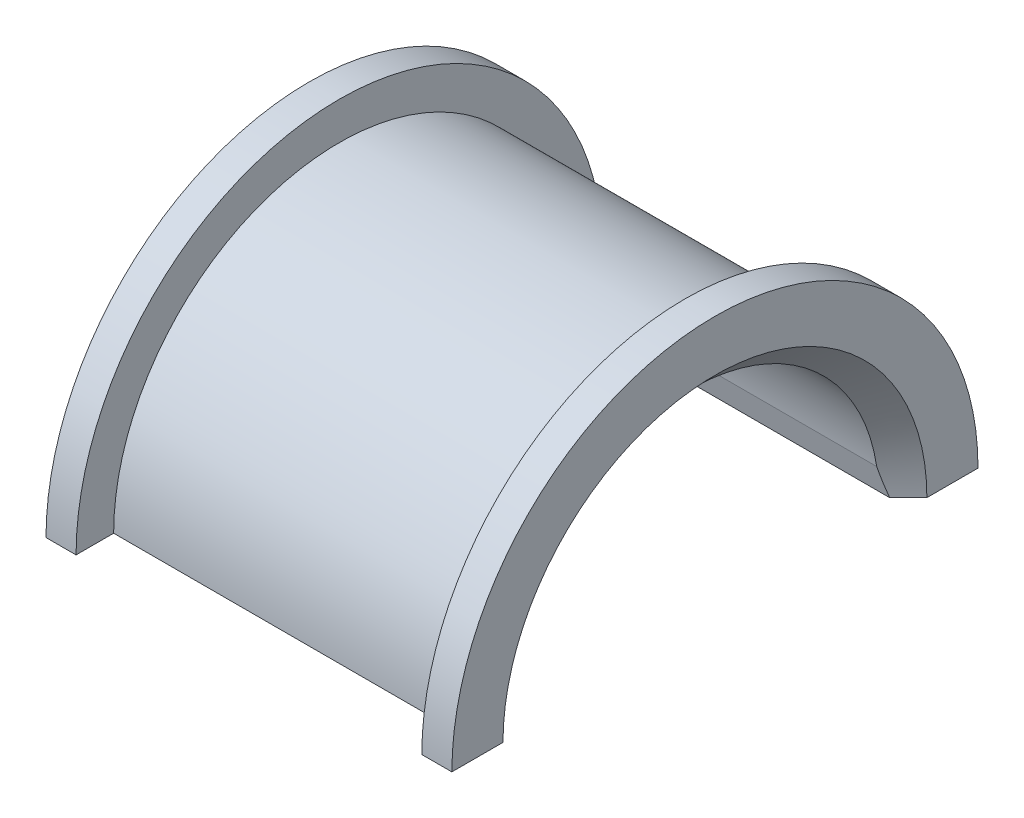
ISO-10303-21;
HEADER;
FILE_DESCRIPTION(('STEP AP214'),'2;1');
FILE_NAME('part.step','',(''),(''),'','','');
FILE_SCHEMA(('AUTOMOTIVE_DESIGN { 1 0 10303 214 1 1 1 1 }'));
ENDSEC;
DATA;
#1=APPLICATION_CONTEXT('core data for automotive mechanical design processes');
#2=APPLICATION_PROTOCOL_DEFINITION('international standard','automotive_design',2000,#1);
#3=PRODUCT_CONTEXT('',#1,'mechanical');
#4=PRODUCT('Part','Part','',(#3));
#5=PRODUCT_RELATED_PRODUCT_CATEGORY('part','',(#4));
#6=PRODUCT_DEFINITION_FORMATION('','',#4);
#7=PRODUCT_DEFINITION_CONTEXT('part definition',#1,'design');
#8=PRODUCT_DEFINITION('design','',#6,#7);
#9=PRODUCT_DEFINITION_SHAPE('','',#8);
#10=(LENGTH_UNIT() NAMED_UNIT(*) SI_UNIT(.MILLI.,.METRE.));
#11=(NAMED_UNIT(*) PLANE_ANGLE_UNIT() SI_UNIT($,.RADIAN.));
#12=(NAMED_UNIT(*) SI_UNIT($,.STERADIAN.) SOLID_ANGLE_UNIT());
#13=UNCERTAINTY_MEASURE_WITH_UNIT(LENGTH_MEASURE(1.E-05),#10,'distance_accuracy_value','');
#14=(GEOMETRIC_REPRESENTATION_CONTEXT(3) GLOBAL_UNCERTAINTY_ASSIGNED_CONTEXT((#13)) GLOBAL_UNIT_ASSIGNED_CONTEXT((#10,
#11,#12)) REPRESENTATION_CONTEXT('',''));
#15=CARTESIAN_POINT('',(0.,0.,0.));
#16=DIRECTION('',(0.,0.,1.));
#17=DIRECTION('',(1.,0.,0.));
#18=AXIS2_PLACEMENT_3D('',#15,#16,#17);
#19=CARTESIAN_POINT('',(-27.1959710235552,0.,0.));
#20=DIRECTION('',(1.,0.,0.));
#21=DIRECTION('',(0.,0.,-1.));
#22=AXIS2_PLACEMENT_3D('',#19,#20,#21);
#23=CYLINDRICAL_SURFACE('',#22,17.5);
#24=CARTESIAN_POINT('',(2.,0.,0.));
#25=DIRECTION('',(1.,0.,0.));
#26=DIRECTION('',(0.,0.,-1.));
#27=AXIS2_PLACEMENT_3D('',#24,#25,#26);
#28=CIRCLE('',#27,17.5);
#29=CARTESIAN_POINT('',(2.,0.,-17.5));
#30=VERTEX_POINT('',#29);
#31=CARTESIAN_POINT('',(2.,0.,17.5));
#32=VERTEX_POINT('',#31);
#33=EDGE_CURVE('E159',#30,#32,#28,.T.);
#34=ORIENTED_EDGE('',*,*,#33,.F.);
#35=DIRECTION('',(-1.,0.,0.));
#36=VECTOR('',#35,1.);
#37=CARTESIAN_POINT('',(0.,0.,-17.5));
#38=LINE('',#37,#36);
#39=CARTESIAN_POINT('',(0.,0.,-17.5));
#40=VERTEX_POINT('',#39);
#41=EDGE_CURVE('E191',#30,#40,#38,.T.);
#42=ORIENTED_EDGE('',*,*,#41,.T.);
#43=CARTESIAN_POINT('',(0.,0.,0.));
#44=DIRECTION('',(1.,0.,0.));
#45=DIRECTION('',(0.,0.,-1.));
#46=AXIS2_PLACEMENT_3D('',#43,#44,#45);
#47=CIRCLE('',#46,17.5);
#48=CARTESIAN_POINT('',(0.,0.,17.5));
#49=VERTEX_POINT('',#48);
#50=EDGE_CURVE('E217',#40,#49,#47,.T.);
#51=ORIENTED_EDGE('',*,*,#50,.T.);
#52=DIRECTION('',(-1.,0.,0.));
#53=VECTOR('',#52,1.);
#54=CARTESIAN_POINT('',(0.,0.,17.5));
#55=LINE('',#54,#53);
#56=EDGE_CURVE('E226',#32,#49,#55,.T.);
#57=ORIENTED_EDGE('',*,*,#56,.F.);
#58=EDGE_LOOP('',(#34,#42,#51,#57));
#59=FACE_BOUND('',#58,.T.);
#60=ADVANCED_FACE('F38',(#59),#23,.T.);
#61=CARTESIAN_POINT('',(2.,0.,-17.5));
#62=DIRECTION('',(1.,0.,0.));
#63=DIRECTION('',(0.,0.,-1.));
#64=AXIS2_PLACEMENT_3D('',#61,#62,#63);
#65=PLANE('',#64);
#66=CARTESIAN_POINT('',(2.,0.,0.));
#67=DIRECTION('',(1.,0.,0.));
#68=DIRECTION('',(0.,0.,-1.));
#69=AXIS2_PLACEMENT_3D('',#66,#67,#68);
#70=CIRCLE('',#69,15.);
#71=CARTESIAN_POINT('',(2.,0.,-15.));
#72=VERTEX_POINT('',#71);
#73=CARTESIAN_POINT('',(2.,0.,15.));
#74=VERTEX_POINT('',#73);
#75=EDGE_CURVE('E157',#72,#74,#70,.T.);
#76=ORIENTED_EDGE('',*,*,#75,.F.);
#77=DIRECTION('',(0.,0.,-1.));
#78=VECTOR('',#77,1.);
#79=CARTESIAN_POINT('',(2.,0.,-17.5));
#80=LINE('',#79,#78);
#81=EDGE_CURVE('E214',#72,#30,#80,.T.);
#82=ORIENTED_EDGE('',*,*,#81,.T.);
#83=ORIENTED_EDGE('',*,*,#33,.T.);
#84=DIRECTION('',(0.,0.,1.));
#85=VECTOR('',#84,1.);
#86=CARTESIAN_POINT('',(2.,0.,17.5));
#87=LINE('',#86,#85);
#88=EDGE_CURVE('E188',#74,#32,#87,.T.);
#89=ORIENTED_EDGE('',*,*,#88,.F.);
#90=EDGE_LOOP('',(#76,#82,#83,#89));
#91=FACE_BOUND('',#90,.T.);
#92=ADVANCED_FACE('F40',(#91),#65,.T.);
#93=CARTESIAN_POINT('',(-27.1959710235552,0.,0.));
#94=DIRECTION('',(1.,0.,0.));
#95=DIRECTION('',(0.,0.,-1.));
#96=AXIS2_PLACEMENT_3D('',#93,#94,#95);
#97=CYLINDRICAL_SURFACE('',#96,15.);
#98=CARTESIAN_POINT('',(25.,0.,0.));
#99=DIRECTION('',(1.,0.,0.));
#100=DIRECTION('',(0.,0.,-1.));
#101=AXIS2_PLACEMENT_3D('',#98,#99,#100);
#102=CIRCLE('',#101,15.);
#103=CARTESIAN_POINT('',(25.,0.,-15.));
#104=VERTEX_POINT('',#103);
#105=CARTESIAN_POINT('',(25.,0.,15.));
#106=VERTEX_POINT('',#105);
#107=EDGE_CURVE('E155',#104,#106,#102,.T.);
#108=ORIENTED_EDGE('',*,*,#107,.F.);
#109=DIRECTION('',(-1.,0.,0.));
#110=VECTOR('',#109,1.);
#111=CARTESIAN_POINT('',(2.,0.,-15.));
#112=LINE('',#111,#110);
#113=EDGE_CURVE('E211',#104,#72,#112,.T.);
#114=ORIENTED_EDGE('',*,*,#113,.T.);
#115=ORIENTED_EDGE('',*,*,#75,.T.);
#116=DIRECTION('',(-1.,0.,0.));
#117=VECTOR('',#116,1.);
#118=CARTESIAN_POINT('',(2.,0.,15.));
#119=LINE('',#118,#117);
#120=EDGE_CURVE('E185',#106,#74,#119,.T.);
#121=ORIENTED_EDGE('',*,*,#120,.F.);
#122=EDGE_LOOP('',(#108,#114,#115,#121));
#123=FACE_BOUND('',#122,.T.);
#124=ADVANCED_FACE('F294',(#123),#97,.T.);
#125=CARTESIAN_POINT('',(25.,0.,-15.));
#126=DIRECTION('',(-1.,0.,0.));
#127=DIRECTION('',(0.,0.,1.));
#128=AXIS2_PLACEMENT_3D('',#125,#126,#127);
#129=PLANE('',#128);
#130=CARTESIAN_POINT('',(25.,0.,0.));
#131=DIRECTION('',(1.,0.,0.));
#132=DIRECTION('',(0.,0.,-1.));
#133=AXIS2_PLACEMENT_3D('',#130,#131,#132);
#134=CIRCLE('',#133,17.5);
#135=CARTESIAN_POINT('',(25.,0.,-17.5));
#136=VERTEX_POINT('',#135);
#137=CARTESIAN_POINT('',(25.,0.,17.5));
#138=VERTEX_POINT('',#137);
#139=EDGE_CURVE('E153',#136,#138,#134,.T.);
#140=ORIENTED_EDGE('',*,*,#139,.F.);
#141=DIRECTION('',(0.,0.,1.));
#142=VECTOR('',#141,1.);
#143=CARTESIAN_POINT('',(25.,0.,-15.));
#144=LINE('',#143,#142);
#145=EDGE_CURVE('E208',#136,#104,#144,.T.);
#146=ORIENTED_EDGE('',*,*,#145,.T.);
#147=ORIENTED_EDGE('',*,*,#107,.T.);
#148=DIRECTION('',(0.,0.,-1.));
#149=VECTOR('',#148,1.);
#150=CARTESIAN_POINT('',(25.,0.,15.));
#151=LINE('',#150,#149);
#152=EDGE_CURVE('E182',#138,#106,#151,.T.);
#153=ORIENTED_EDGE('',*,*,#152,.F.);
#154=EDGE_LOOP('',(#140,#146,#147,#153));
#155=FACE_BOUND('',#154,.T.);
#156=ADVANCED_FACE('F291',(#155),#129,.T.);
#157=CARTESIAN_POINT('',(-27.1959710235552,0.,0.));
#158=DIRECTION('',(1.,0.,0.));
#159=DIRECTION('',(0.,0.,-1.));
#160=AXIS2_PLACEMENT_3D('',#157,#158,#159);
#161=CYLINDRICAL_SURFACE('',#160,17.5);
#162=CARTESIAN_POINT('',(27.,0.,0.));
#163=DIRECTION('',(1.,0.,0.));
#164=DIRECTION('',(0.,0.,-1.));
#165=AXIS2_PLACEMENT_3D('',#162,#163,#164);
#166=CIRCLE('',#165,17.5);
#167=CARTESIAN_POINT('',(27.,0.,-17.5));
#168=VERTEX_POINT('',#167);
#169=CARTESIAN_POINT('',(27.,0.,17.5));
#170=VERTEX_POINT('',#169);
#171=EDGE_CURVE('E146',#168,#170,#166,.T.);
#172=ORIENTED_EDGE('',*,*,#171,.F.);
#173=DIRECTION('',(-1.,0.,0.));
#174=VECTOR('',#173,1.);
#175=CARTESIAN_POINT('',(25.,0.,-17.5));
#176=LINE('',#175,#174);
#177=EDGE_CURVE('E205',#168,#136,#176,.T.);
#178=ORIENTED_EDGE('',*,*,#177,.T.);
#179=ORIENTED_EDGE('',*,*,#139,.T.);
#180=DIRECTION('',(-1.,0.,0.));
#181=VECTOR('',#180,1.);
#182=CARTESIAN_POINT('',(25.,0.,17.5));
#183=LINE('',#182,#181);
#184=EDGE_CURVE('E174',#170,#138,#183,.T.);
#185=ORIENTED_EDGE('',*,*,#184,.F.);
#186=EDGE_LOOP('',(#172,#178,#179,#185));
#187=FACE_BOUND('',#186,.T.);
#188=ADVANCED_FACE('F287',(#187),#161,.T.);
#189=CARTESIAN_POINT('',(27.,0.,-17.5));
#190=DIRECTION('',(1.,0.,0.));
#191=DIRECTION('',(0.,0.,-1.));
#192=AXIS2_PLACEMENT_3D('',#189,#190,#191);
#193=PLANE('',#192);
#194=CARTESIAN_POINT('',(27.,0.,0.));
#195=DIRECTION('',(1.,0.,0.));
#196=DIRECTION('',(0.,0.,-1.));
#197=AXIS2_PLACEMENT_3D('',#194,#195,#196);
#198=CIRCLE('',#197,14.1);
#199=CARTESIAN_POINT('',(27.,0.,-14.1));
#200=VERTEX_POINT('',#199);
#201=CARTESIAN_POINT('',(27.,0.,14.1));
#202=VERTEX_POINT('',#201);
#203=EDGE_CURVE('E143',#200,#202,#198,.T.);
#204=ORIENTED_EDGE('',*,*,#203,.F.);
#205=DIRECTION('',(0.,0.,-1.));
#206=VECTOR('',#205,1.);
#207=CARTESIAN_POINT('',(27.,0.,-17.5));
#208=LINE('',#207,#206);
#209=EDGE_CURVE('E202',#200,#168,#208,.T.);
#210=ORIENTED_EDGE('',*,*,#209,.T.);
#211=ORIENTED_EDGE('',*,*,#171,.T.);
#212=DIRECTION('',(0.,0.,1.));
#213=VECTOR('',#212,1.);
#214=CARTESIAN_POINT('',(27.,0.,17.5));
#215=LINE('',#214,#213);
#216=EDGE_CURVE('E172',#202,#170,#215,.T.);
#217=ORIENTED_EDGE('',*,*,#216,.F.);
#218=EDGE_LOOP('',(#204,#210,#211,#217));
#219=FACE_BOUND('',#218,.T.);
#220=ADVANCED_FACE('F272',(#219),#193,.T.);
#221=CARTESIAN_POINT('',(25.4,0.,0.));
#222=DIRECTION('',(1.,0.,0.));
#223=DIRECTION('',(0.,0.,-1.));
#224=AXIS2_PLACEMENT_3D('',#221,#222,#223);
#225=CONICAL_SURFACE('',#224,12.5,0.785398163397448);
#226=CARTESIAN_POINT('',(26.2484013107677,-1.50523763764391,-13.2632604290018));
#227=CARTESIAN_POINT('',(26.1742125034005,-1.3094727485897,-13.2108053850733));
#228=CARTESIAN_POINT('',(26.1035443149631,-1.11248075646836,-13.158021539869));
#229=CARTESIAN_POINT('',(25.9699618111538,-0.715990498866815,-13.0517822955379));
#230=CARTESIAN_POINT('',(25.9070500982291,-0.516491416814952,-12.9983266776113));
#231=CARTESIAN_POINT('',(25.7321191017047,0.0821274818673336,-12.8379272271354));
#232=CARTESIAN_POINT('',(25.632578159723,0.484803517368267,-12.7300305086115));
#233=CARTESIAN_POINT('',(25.5125692100453,1.09432320495648,-12.5667102005514));
#234=CARTESIAN_POINT('',(25.4774360080468,1.29855542495721,-12.5119863421338));
#235=CARTESIAN_POINT('',(25.4175143051028,1.70845139513823,-12.402155047943));
#236=CARTESIAN_POINT('',(25.392725661705,1.91411512556592,-12.3470476174625));
#237=CARTESIAN_POINT('',(25.3537853360265,2.32813001355298,-12.2361126625719));
#238=CARTESIAN_POINT('',(25.3397250722862,2.53648921154256,-12.180282983735));
#239=CARTESIAN_POINT('',(25.3228030378697,2.95367350202841,-12.0684987900044));
#240=CARTESIAN_POINT('',(25.3199436107622,3.16249868287876,-12.0125442514363));
#241=CARTESIAN_POINT('',(25.322795248114,3.37126304142832,-11.9566060101545));
#242=B_SPLINE_CURVE_WITH_KNOTS('',3,(#226,#227,#228,#229,#230,#231,#232,#233,#234,#235,#236,
#237,#238,#239,#240,#241),.UNSPECIFIED.,.F.,.F.,(4,2,2,2,2,2,2,4),(0.,0.647386310265038,
1.29498924342088,2.57883998360912,3.22164408276933,3.86443932975761,4.5126526054734,
5.16100150063464),.UNSPECIFIED.);
#243=CARTESIAN_POINT('',(25.7599332195781,0.,-12.8599332195781));
#244=VERTEX_POINT('',#243);
#245=CARTESIAN_POINT('',(25.4,1.86602540378441,-12.3599332195781));
#246=VERTEX_POINT('',#245);
#247=EDGE_CURVE('E125',#244,#246,#242,.T.);
#248=ORIENTED_EDGE('',*,*,#247,.F.);
#249=DIRECTION('',(0.707106781186549,0.,-0.707106781186546));
#250=VECTOR('',#249,1.);
#251=CARTESIAN_POINT('',(27.,0.,-14.1));
#252=LINE('',#251,#250);
#253=EDGE_CURVE('E200',#244,#200,#252,.T.);
#254=ORIENTED_EDGE('',*,*,#253,.T.);
#255=ORIENTED_EDGE('',*,*,#203,.T.);
#256=DIRECTION('',(0.707106781186549,0.,0.707106781186546));
#257=VECTOR('',#256,1.);
#258=CARTESIAN_POINT('',(27.,0.,14.1));
#259=LINE('',#258,#257);
#260=CARTESIAN_POINT('',(25.7599332195781,0.,12.8599332195781));
#261=VERTEX_POINT('',#260);
#262=EDGE_CURVE('E164',#261,#202,#259,.T.);
#263=ORIENTED_EDGE('',*,*,#262,.F.);
#264=CARTESIAN_POINT('',(25.322795248114,3.37126304142832,11.9566060101545));
#265=CARTESIAN_POINT('',(25.3207751303388,3.22191651610366,11.9966232910076));
#266=CARTESIAN_POINT('',(25.3216547122165,3.07254784943274,12.0366465046166));
#267=CARTESIAN_POINT('',(25.3291708796214,2.77395399400931,12.1166544870422));
#268=CARTESIAN_POINT('',(25.335807137728,2.62472879757991,12.1566392579159));
#269=CARTESIAN_POINT('',(25.3642717238281,2.17777214668943,12.2764009315737));
#270=CARTESIAN_POINT('',(25.3946526566406,1.88051096406728,12.3560518253984));
#271=CARTESIAN_POINT('',(25.4766560164423,1.29214121187084,12.5137050253504));
#272=CARTESIAN_POINT('',(25.5280404478011,1.00100094414443,12.5917158249718));
#273=CARTESIAN_POINT('',(25.6503360314772,0.42258663279072,12.7467014725897));
#274=CARTESIAN_POINT('',(25.7212465818298,0.135312470262749,12.8236763524454));
#275=CARTESIAN_POINT('',(25.8328315457774,-0.263886992744385,12.9306415261771));
#276=CARTESIAN_POINT('',(25.8661760137994,-0.377776277403174,12.961158068028));
#277=CARTESIAN_POINT('',(25.9355356276717,-0.604776477812425,13.0219825884093));
#278=CARTESIAN_POINT('',(25.97155031252,-0.717887524254625,13.0522906019585));
#279=CARTESIAN_POINT('',(26.0462883240167,-0.943837640993667,13.1128337532685));
#280=CARTESIAN_POINT('',(26.0850232530877,-1.05667311915317,13.1430679285189));
#281=CARTESIAN_POINT('',(26.1649239330655,-1.28155410283706,13.2033246064901));
#282=CARTESIAN_POINT('',(26.2060899813343,-1.39359950983993,13.2333470828122));
#283=CARTESIAN_POINT('',(26.2484013107677,-1.50523763764391,13.2632604290018));
#284=B_SPLINE_CURVE_WITH_KNOTS('',3,(#264,#265,#266,#267,#268,#269,#270,#271,#272,#273,#274,
#275,#276,#277,#278,#279,#280,#281,#282,#283),.UNSPECIFIED.,.F.,.F.,(4,2,2,2,2,2,2,2,2,4),(0.,
0.463828057975735,0.927629736690716,1.85446265420115,2.77107236023496,3.68765381155108,
4.0552261739228,4.42273522354899,4.79192009759984,5.16115022237338),.UNSPECIFIED.);
#285=CARTESIAN_POINT('',(25.4,1.86602540378441,12.3599332195781));
#286=VERTEX_POINT('',#285);
#287=EDGE_CURVE('E60',#286,#261,#284,.T.);
#288=ORIENTED_EDGE('',*,*,#287,.F.);
#289=CARTESIAN_POINT('',(25.4,0.,0.));
#290=DIRECTION('',(1.,0.,0.));
#291=DIRECTION('',(0.,0.,-1.));
#292=AXIS2_PLACEMENT_3D('',#289,#290,#291);
#293=CIRCLE('',#292,12.5);
#294=EDGE_CURVE('E138',#246,#286,#293,.T.);
#295=ORIENTED_EDGE('',*,*,#294,.F.);
#296=EDGE_LOOP('',(#248,#254,#255,#263,#288,#295));
#297=FACE_BOUND('',#296,.T.);
#298=ADVANCED_FACE('F141',(#297),#225,.F.);
#299=CARTESIAN_POINT('',(-27.1959710235552,0.,0.));
#300=DIRECTION('',(1.,0.,0.));
#301=DIRECTION('',(0.,0.,-1.));
#302=AXIS2_PLACEMENT_3D('',#299,#300,#301);
#303=CYLINDRICAL_SURFACE('',#302,12.5);
#304=DIRECTION('',(-1.,0.,0.));
#305=VECTOR('',#304,1.);
#306=CARTESIAN_POINT('',(27.,1.86602540378441,-12.3599332195781));
#307=LINE('',#306,#305);
#308=CARTESIAN_POINT('',(1.6,1.86602540378441,-12.3599332195781));
#309=VERTEX_POINT('',#308);
#310=EDGE_CURVE('E128',#246,#309,#307,.T.);
#311=ORIENTED_EDGE('',*,*,#310,.F.);
#312=ORIENTED_EDGE('',*,*,#294,.T.);
#313=DIRECTION('',(-1.,0.,0.));
#314=VECTOR('',#313,1.);
#315=CARTESIAN_POINT('',(27.,1.86602540378441,12.3599332195781));
#316=LINE('',#315,#314);
#317=CARTESIAN_POINT('',(1.6,1.86602540378441,12.3599332195781));
#318=VERTEX_POINT('',#317);
#319=EDGE_CURVE('E132',#286,#318,#316,.T.);
#320=ORIENTED_EDGE('',*,*,#319,.T.);
#321=CARTESIAN_POINT('',(1.6,0.,0.));
#322=DIRECTION('',(1.,0.,0.));
#323=DIRECTION('',(0.,0.,-1.));
#324=AXIS2_PLACEMENT_3D('',#321,#322,#323);
#325=CIRCLE('',#324,12.5);
#326=EDGE_CURVE('E139',#309,#318,#325,.T.);
#327=ORIENTED_EDGE('',*,*,#326,.F.);
#328=EDGE_LOOP('',(#311,#312,#320,#327));
#329=FACE_BOUND('',#328,.T.);
#330=ADVANCED_FACE('F136',(#329),#303,.F.);
#331=CARTESIAN_POINT('',(0.,0.,0.));
#332=DIRECTION('',(-1.,0.,0.));
#333=DIRECTION('',(0.,0.,1.));
#334=AXIS2_PLACEMENT_3D('',#331,#332,#333);
#335=CONICAL_SURFACE('',#334,14.1,0.785398163397446);
#336=CARTESIAN_POINT('',(1.677204751886,3.37126304142832,-11.9566060101545));
#337=CARTESIAN_POINT('',(1.67922486966115,3.22191651610366,-11.9966232910076));
#338=CARTESIAN_POINT('',(1.67834528778346,3.07254784943274,-12.0366465046166));
#339=CARTESIAN_POINT('',(1.67082912037863,2.77395399400931,-12.1166544870422));
#340=CARTESIAN_POINT('',(1.66419286227199,2.62472879757991,-12.1566392579159));
#341=CARTESIAN_POINT('',(1.63572827617191,2.17777214668942,-12.2764009315737));
#342=CARTESIAN_POINT('',(1.60534734335937,1.88051096406728,-12.3560518253984));
#343=CARTESIAN_POINT('',(1.52334398355772,1.29214121187083,-12.5137050253504));
#344=CARTESIAN_POINT('',(1.47195955219889,1.00100094414443,-12.5917158249718));
#345=CARTESIAN_POINT('',(1.34966396852275,0.422586632790716,-12.7467014725897));
#346=CARTESIAN_POINT('',(1.27875341817019,0.135312470262745,-12.8236763524454));
#347=CARTESIAN_POINT('',(1.16716845422256,-0.263886992744388,-12.9306415261771));
#348=CARTESIAN_POINT('',(1.13382398620059,-0.377776277403177,-12.961158068028));
#349=CARTESIAN_POINT('',(1.06446437232834,-0.604776477812428,-13.0219825884093));
#350=CARTESIAN_POINT('',(1.02844968748001,-0.717887524254628,-13.0522906019585));
#351=CARTESIAN_POINT('',(0.953711675983266,-0.94383764099367,-13.1128337532685));
#352=CARTESIAN_POINT('',(0.914976746912264,-1.05667311915317,-13.1430679285189));
#353=CARTESIAN_POINT('',(0.835076066934532,-1.28155410283706,-13.2033246064901));
#354=CARTESIAN_POINT('',(0.793910018665653,-1.39359950983993,-13.2333470828122));
#355=CARTESIAN_POINT('',(0.751598689232338,-1.50523763764391,-13.2632604290018));
#356=B_SPLINE_CURVE_WITH_KNOTS('',3,(#336,#337,#338,#339,#340,#341,#342,#343,#344,#345,#346,
#347,#348,#349,#350,#351,#352,#353,#354,#355),.UNSPECIFIED.,.F.,.F.,(4,2,2,2,2,2,2,2,2,4),(0.,
0.463828057975735,0.927629736690717,1.85446265420115,2.77107236023496,3.68765381155109,
4.0552261739228,4.42273522354899,4.79192009759984,5.16115022237337),.UNSPECIFIED.);
#357=CARTESIAN_POINT('',(1.24006678042185,0.,-12.8599332195781));
#358=VERTEX_POINT('',#357);
#359=EDGE_CURVE('E52',#309,#358,#356,.T.);
#360=ORIENTED_EDGE('',*,*,#359,.F.);
#361=ORIENTED_EDGE('',*,*,#326,.T.);
#362=CARTESIAN_POINT('',(0.751598689232339,-1.50523763764391,13.2632604290018));
#363=CARTESIAN_POINT('',(0.825787496599475,-1.3094727485897,13.2108053850733));
#364=CARTESIAN_POINT('',(0.896455685036848,-1.11248075646836,13.158021539869));
#365=CARTESIAN_POINT('',(1.03003818884622,-0.715990498866817,13.0517822955379));
#366=CARTESIAN_POINT('',(1.09294990177093,-0.516491416814954,12.9983266776113));
#367=CARTESIAN_POINT('',(1.26788089829532,0.0821274818673323,12.8379272271354));
#368=CARTESIAN_POINT('',(1.36742184027695,0.484803517368266,12.7300305086115));
#369=CARTESIAN_POINT('',(1.4874307899547,1.09432320495648,12.5667102005514));
#370=CARTESIAN_POINT('',(1.52256399195316,1.29855542495721,12.5119863421338));
#371=CARTESIAN_POINT('',(1.58248569489724,1.70845139513823,12.402155047943));
#372=CARTESIAN_POINT('',(1.60727433829495,1.91411512556592,12.3470476174625));
#373=CARTESIAN_POINT('',(1.64621466397349,2.32813001355298,12.2361126625719));
#374=CARTESIAN_POINT('',(1.66027492771378,2.53648921154256,12.180282983735));
#375=CARTESIAN_POINT('',(1.67719696213031,2.95367350202841,12.0684987900044));
#376=CARTESIAN_POINT('',(1.68005638923781,3.16249868287876,12.0125442514363));
#377=CARTESIAN_POINT('',(1.677204751886,3.37126304142832,11.9566060101545));
#378=B_SPLINE_CURVE_WITH_KNOTS('',3,(#362,#363,#364,#365,#366,#367,#368,#369,#370,#371,#372,
#373,#374,#375,#376,#377),.UNSPECIFIED.,.F.,.F.,(4,2,2,2,2,2,2,4),(0.,0.647386310265037,
1.29498924342088,2.57883998360912,3.22164408276933,3.86443932975761,4.5126526054734,
5.16100150063464),.UNSPECIFIED.);
#379=CARTESIAN_POINT('',(1.24006678042185,0.,12.8599332195781));
#380=VERTEX_POINT('',#379);
#381=EDGE_CURVE('E228',#380,#318,#378,.T.);
#382=ORIENTED_EDGE('',*,*,#381,.F.);
#383=DIRECTION('',(0.707106781186549,0.,-0.707106781186546));
#384=VECTOR('',#383,1.);
#385=CARTESIAN_POINT('',(1.6,0.,12.5));
#386=LINE('',#385,#384);
#387=CARTESIAN_POINT('',(0.,0.,14.1));
#388=VERTEX_POINT('',#387);
#389=EDGE_CURVE('E167',#388,#380,#386,.T.);
#390=ORIENTED_EDGE('',*,*,#389,.F.);
#391=CARTESIAN_POINT('',(0.,0.,0.));
#392=DIRECTION('',(1.,0.,0.));
#393=DIRECTION('',(0.,0.,-1.));
#394=AXIS2_PLACEMENT_3D('',#391,#392,#393);
#395=CIRCLE('',#394,14.1);
#396=CARTESIAN_POINT('',(0.,0.,-14.1));
#397=VERTEX_POINT('',#396);
#398=EDGE_CURVE('E148',#397,#388,#395,.T.);
#399=ORIENTED_EDGE('',*,*,#398,.F.);
#400=DIRECTION('',(0.707106781186549,0.,0.707106781186546));
#401=VECTOR('',#400,1.);
#402=CARTESIAN_POINT('',(1.6,0.,-12.5));
#403=LINE('',#402,#401);
#404=EDGE_CURVE('E197',#397,#358,#403,.T.);
#405=ORIENTED_EDGE('',*,*,#404,.T.);
#406=EDGE_LOOP('',(#360,#361,#382,#390,#399,#405));
#407=FACE_BOUND('',#406,.T.);
#408=ADVANCED_FACE('F227',(#407),#335,.F.);
#409=CARTESIAN_POINT('',(0.,0.,-14.1));
#410=DIRECTION('',(-1.,0.,0.));
#411=DIRECTION('',(0.,0.,1.));
#412=AXIS2_PLACEMENT_3D('',#409,#410,#411);
#413=PLANE('',#412);
#414=DIRECTION('',(0.,0.,1.));
#415=VECTOR('',#414,1.);
#416=CARTESIAN_POINT('',(0.,0.,-14.1));
#417=LINE('',#416,#415);
#418=EDGE_CURVE('E194',#40,#397,#417,.T.);
#419=ORIENTED_EDGE('',*,*,#418,.T.);
#420=ORIENTED_EDGE('',*,*,#398,.T.);
#421=DIRECTION('',(0.,0.,-1.));
#422=VECTOR('',#421,1.);
#423=CARTESIAN_POINT('',(0.,0.,14.1));
#424=LINE('',#423,#422);
#425=EDGE_CURVE('E176',#49,#388,#424,.T.);
#426=ORIENTED_EDGE('',*,*,#425,.F.);
#427=ORIENTED_EDGE('',*,*,#50,.F.);
#428=EDGE_LOOP('',(#419,#420,#426,#427));
#429=FACE_BOUND('',#428,.T.);
#430=ADVANCED_FACE('F220',(#429),#413,.T.);
#431=CARTESIAN_POINT('',(0.,0.,0.));
#432=DIRECTION('',(0.,-1.,0.));
#433=DIRECTION('',(-1.,0.,0.));
#434=AXIS2_PLACEMENT_3D('',#431,#432,#433);
#435=PLANE('',#434);
#436=DIRECTION('',(1.,0.,0.));
#437=VECTOR('',#436,1.);
#438=CARTESIAN_POINT('',(0.,0.,-12.8599332195781));
#439=LINE('',#438,#437);
#440=EDGE_CURVE('E11',#358,#244,#439,.T.);
#441=ORIENTED_EDGE('',*,*,#440,.F.);
#442=ORIENTED_EDGE('',*,*,#404,.F.);
#443=ORIENTED_EDGE('',*,*,#418,.F.);
#444=ORIENTED_EDGE('',*,*,#41,.F.);
#445=ORIENTED_EDGE('',*,*,#81,.F.);
#446=ORIENTED_EDGE('',*,*,#113,.F.);
#447=ORIENTED_EDGE('',*,*,#145,.F.);
#448=ORIENTED_EDGE('',*,*,#177,.F.);
#449=ORIENTED_EDGE('',*,*,#209,.F.);
#450=ORIENTED_EDGE('',*,*,#253,.F.);
#451=EDGE_LOOP('',(#441,#442,#443,#444,#445,#446,#447,#448,#449,#450));
#452=FACE_BOUND('',#451,.T.);
#453=ADVANCED_FACE('F256',(#452),#435,.T.);
#454=CARTESIAN_POINT('',(0.,0.,0.));
#455=DIRECTION('',(0.,1.,0.));
#456=DIRECTION('',(-1.,0.,0.));
#457=AXIS2_PLACEMENT_3D('',#454,#455,#456);
#458=PLANE('',#457);
#459=ORIENTED_EDGE('',*,*,#389,.T.);
#460=DIRECTION('',(1.,0.,0.));
#461=VECTOR('',#460,1.);
#462=CARTESIAN_POINT('',(0.,0.,12.8599332195781));
#463=LINE('',#462,#461);
#464=EDGE_CURVE('E46',#380,#261,#463,.T.);
#465=ORIENTED_EDGE('',*,*,#464,.T.);
#466=ORIENTED_EDGE('',*,*,#262,.T.);
#467=ORIENTED_EDGE('',*,*,#216,.T.);
#468=ORIENTED_EDGE('',*,*,#184,.T.);
#469=ORIENTED_EDGE('',*,*,#152,.T.);
#470=ORIENTED_EDGE('',*,*,#120,.T.);
#471=ORIENTED_EDGE('',*,*,#88,.T.);
#472=ORIENTED_EDGE('',*,*,#56,.T.);
#473=ORIENTED_EDGE('',*,*,#425,.T.);
#474=EDGE_LOOP('',(#459,#465,#466,#467,#468,#469,#470,#471,#472,#473));
#475=FACE_BOUND('',#474,.T.);
#476=ADVANCED_FACE('F162',(#475),#458,.F.);
#477=CARTESIAN_POINT('',(27.,0.,12.8599332195781));
#478=DIRECTION('',(0.,0.258819045102524,0.965925826289068));
#479=DIRECTION('',(0.,-0.965925826289068,0.258819045102524));
#480=AXIS2_PLACEMENT_3D('',#477,#478,#479);
#481=PLANE('',#480);
#482=ORIENTED_EDGE('',*,*,#287,.T.);
#483=ORIENTED_EDGE('',*,*,#464,.F.);
#484=ORIENTED_EDGE('',*,*,#381,.T.);
#485=ORIENTED_EDGE('',*,*,#319,.F.);
#486=EDGE_LOOP('',(#482,#483,#484,#485));
#487=FACE_BOUND('',#486,.T.);
#488=ADVANCED_FACE('F247',(#487),#481,.F.);
#489=CARTESIAN_POINT('',(27.,0.,-12.8599332195781));
#490=DIRECTION('',(0.,0.258819045102524,-0.965925826289068));
#491=DIRECTION('',(0.,0.965925826289068,0.258819045102524));
#492=AXIS2_PLACEMENT_3D('',#489,#490,#491);
#493=PLANE('',#492);
#494=ORIENTED_EDGE('',*,*,#247,.T.);
#495=ORIENTED_EDGE('',*,*,#310,.T.);
#496=ORIENTED_EDGE('',*,*,#359,.T.);
#497=ORIENTED_EDGE('',*,*,#440,.T.);
#498=EDGE_LOOP('',(#494,#495,#496,#497));
#499=FACE_BOUND('',#498,.T.);
#500=ADVANCED_FACE('F127',(#499),#493,.F.);
#501=CLOSED_SHELL('',(#60,#92,#124,#156,#188,#220,#298,#330,#408,#430,#453,#476,#488,#500));
#502=MANIFOLD_SOLID_BREP('B2',#501);
#503=ADVANCED_BREP_SHAPE_REPRESENTATION('',(#18,#502),#14);
#504=SHAPE_DEFINITION_REPRESENTATION(#9,#503);
ENDSEC;
END-ISO-10303-21;
